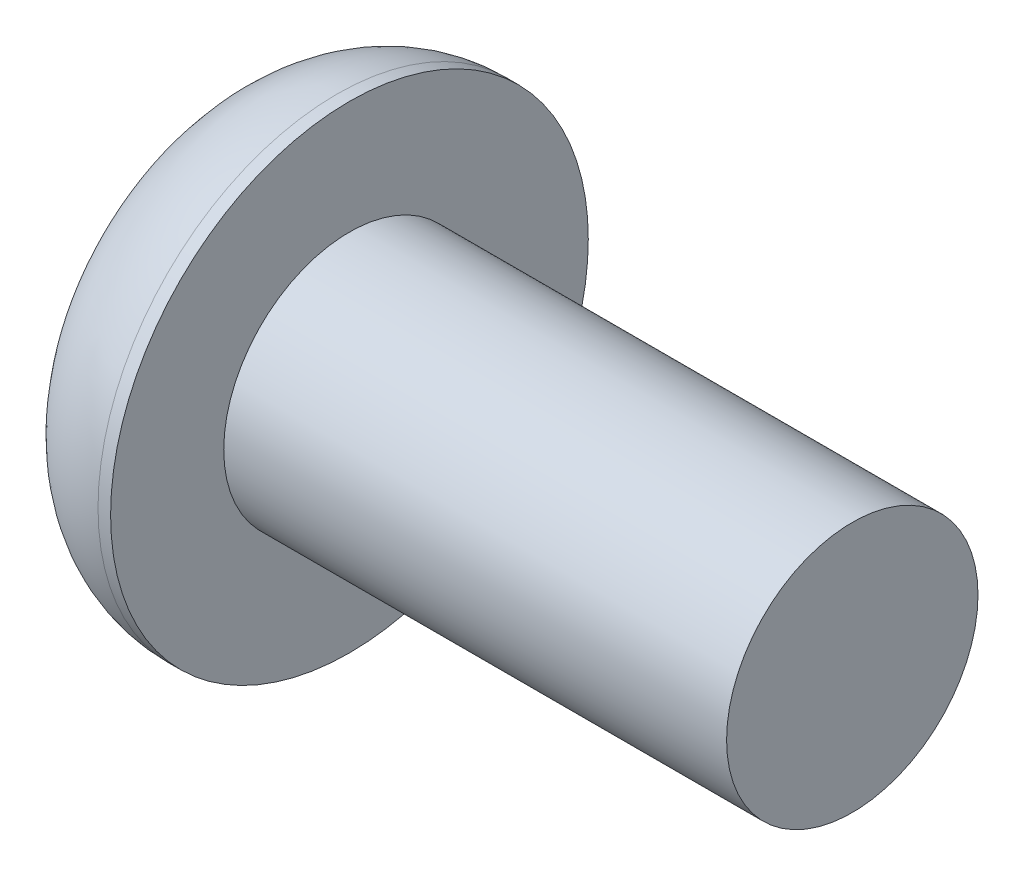
ISO-10303-21;
HEADER;
FILE_DESCRIPTION(('STEP AP214'),'2;1');
FILE_NAME('part.step','',(''),(''),'','','');
FILE_SCHEMA(('AUTOMOTIVE_DESIGN { 1 0 10303 214 1 1 1 1 }'));
ENDSEC;
DATA;
#1=APPLICATION_CONTEXT('core data for automotive mechanical design processes');
#2=APPLICATION_PROTOCOL_DEFINITION('international standard','automotive_design',2000,#1);
#3=PRODUCT_CONTEXT('',#1,'mechanical');
#4=PRODUCT('Part','Part','',(#3));
#5=PRODUCT_RELATED_PRODUCT_CATEGORY('part','',(#4));
#6=PRODUCT_DEFINITION_FORMATION('','',#4);
#7=PRODUCT_DEFINITION_CONTEXT('part definition',#1,'design');
#8=PRODUCT_DEFINITION('design','',#6,#7);
#9=PRODUCT_DEFINITION_SHAPE('','',#8);
#10=(LENGTH_UNIT() NAMED_UNIT(*) SI_UNIT(.MILLI.,.METRE.));
#11=(NAMED_UNIT(*) PLANE_ANGLE_UNIT() SI_UNIT($,.RADIAN.));
#12=(NAMED_UNIT(*) SI_UNIT($,.STERADIAN.) SOLID_ANGLE_UNIT());
#13=UNCERTAINTY_MEASURE_WITH_UNIT(LENGTH_MEASURE(1.E-05),#10,'distance_accuracy_value','');
#14=(GEOMETRIC_REPRESENTATION_CONTEXT(3) GLOBAL_UNCERTAINTY_ASSIGNED_CONTEXT((#13)) GLOBAL_UNIT_ASSIGNED_CONTEXT((#10,
#11,#12)) REPRESENTATION_CONTEXT('',''));
#15=CARTESIAN_POINT('',(0.,0.,0.));
#16=DIRECTION('',(0.,0.,1.));
#17=DIRECTION('',(1.,0.,0.));
#18=AXIS2_PLACEMENT_3D('',#15,#16,#17);
#19=CARTESIAN_POINT('',(0.,0.,-2.25));
#20=DIRECTION('',(-1.,0.,0.));
#21=DIRECTION('',(0.,0.,1.));
#22=AXIS2_PLACEMENT_3D('',#19,#20,#21);
#23=PLANE('',#22);
#24=DIRECTION('',(0.,0.866025403784439,0.5));
#25=VECTOR('',#24,1.);
#26=CARTESIAN_POINT('',(0.,-1.5,0.866025403784439));
#27=LINE('',#26,#25);
#28=CARTESIAN_POINT('',(0.,-1.5,0.866025403784439));
#29=VERTEX_POINT('',#28);
#30=CARTESIAN_POINT('',(0.,0.,1.73205080756888));
#31=VERTEX_POINT('',#30);
#32=EDGE_CURVE('E47',#29,#31,#27,.T.);
#33=ORIENTED_EDGE('',*,*,#32,.F.);
#34=DIRECTION('',(0.,0.,1.));
#35=VECTOR('',#34,1.);
#36=CARTESIAN_POINT('',(0.,-1.5,-0.866025403784439));
#37=LINE('',#36,#35);
#38=CARTESIAN_POINT('',(0.,-1.5,-0.866025403784439));
#39=VERTEX_POINT('',#38);
#40=EDGE_CURVE('E130',#39,#29,#37,.T.);
#41=ORIENTED_EDGE('',*,*,#40,.F.);
#42=DIRECTION('',(0.,-0.866025403784439,0.5));
#43=VECTOR('',#42,1.);
#44=CARTESIAN_POINT('',(0.,0.,-1.73205080756888));
#45=LINE('',#44,#43);
#46=CARTESIAN_POINT('',(0.,0.,-1.73205080756888));
#47=VERTEX_POINT('',#46);
#48=EDGE_CURVE('E128',#47,#39,#45,.T.);
#49=ORIENTED_EDGE('',*,*,#48,.F.);
#50=DIRECTION('',(0.,-0.866025403784439,-0.5));
#51=VECTOR('',#50,1.);
#52=CARTESIAN_POINT('',(0.,1.5,-0.866025403784439));
#53=LINE('',#52,#51);
#54=CARTESIAN_POINT('',(0.,1.5,-0.866025403784439));
#55=VERTEX_POINT('',#54);
#56=EDGE_CURVE('E95',#55,#47,#53,.T.);
#57=ORIENTED_EDGE('',*,*,#56,.F.);
#58=DIRECTION('',(0.,0.,-1.));
#59=VECTOR('',#58,1.);
#60=CARTESIAN_POINT('',(0.,1.5,0.866025403784438));
#61=LINE('',#60,#59);
#62=CARTESIAN_POINT('',(0.,1.5,0.866025403784438));
#63=VERTEX_POINT('',#62);
#64=EDGE_CURVE('E124',#63,#55,#61,.T.);
#65=ORIENTED_EDGE('',*,*,#64,.F.);
#66=DIRECTION('',(0.,0.866025403784438,-0.5));
#67=VECTOR('',#66,1.);
#68=CARTESIAN_POINT('',(0.,0.,1.73205080756888));
#69=LINE('',#68,#67);
#70=EDGE_CURVE('E121',#31,#63,#69,.T.);
#71=ORIENTED_EDGE('',*,*,#70,.F.);
#72=EDGE_LOOP('',(#33,#41,#49,#57,#65,#71));
#73=FACE_BOUND('',#72,.T.);
#74=CARTESIAN_POINT('',(0.,0.,0.));
#75=DIRECTION('',(1.,0.,0.));
#76=DIRECTION('',(0.,0.,-1.));
#77=AXIS2_PLACEMENT_3D('',#74,#75,#76);
#78=CIRCLE('',#77,2.25);
#79=CARTESIAN_POINT('',(0.,0.,-2.25));
#80=VERTEX_POINT('',#79);
#81=EDGE_CURVE('E11',#80,#80,#78,.T.);
#82=ORIENTED_EDGE('',*,*,#81,.F.);
#83=EDGE_LOOP('',(#82));
#84=FACE_BOUND('',#83,.T.);
#85=ADVANCED_FACE('F33',(#73,#84),#23,.T.);
#86=CARTESIAN_POINT('',(2.5,0.,0.));
#87=DIRECTION('',(1.,0.,0.));
#88=DIRECTION('',(0.,0.,-1.));
#89=AXIS2_PLACEMENT_3D('',#86,#87,#88);
#90=DEGENERATE_TOROIDAL_SURFACE('',#89,2.25,2.5,.T.);
#91=ORIENTED_EDGE('',*,*,#81,.T.);
#92=EDGE_LOOP('',(#91));
#93=FACE_BOUND('',#92,.T.);
#94=CARTESIAN_POINT('',(2.5,0.,0.));
#95=DIRECTION('',(1.,0.,0.));
#96=DIRECTION('',(0.,0.,-1.));
#97=AXIS2_PLACEMENT_3D('',#94,#95,#96);
#98=CIRCLE('',#97,4.75);
#99=CARTESIAN_POINT('',(2.5,0.,-4.75));
#100=VERTEX_POINT('',#99);
#101=EDGE_CURVE('E40',#100,#100,#98,.T.);
#102=ORIENTED_EDGE('',*,*,#101,.F.);
#103=EDGE_LOOP('',(#102));
#104=FACE_BOUND('',#103,.T.);
#105=ADVANCED_FACE('F153',(#93,#104),#90,.T.);
#106=CARTESIAN_POINT('',(0.,0.,0.));
#107=DIRECTION('',(1.,0.,0.));
#108=DIRECTION('',(0.,0.,-1.));
#109=AXIS2_PLACEMENT_3D('',#106,#107,#108);
#110=CYLINDRICAL_SURFACE('',#109,4.75);
#111=ORIENTED_EDGE('',*,*,#101,.T.);
#112=EDGE_LOOP('',(#111));
#113=FACE_BOUND('',#112,.T.);
#114=CARTESIAN_POINT('',(2.75,0.,0.));
#115=DIRECTION('',(1.,0.,0.));
#116=DIRECTION('',(0.,0.,-1.));
#117=AXIS2_PLACEMENT_3D('',#114,#115,#116);
#118=CIRCLE('',#117,4.75);
#119=CARTESIAN_POINT('',(2.75,0.,-4.75));
#120=VERTEX_POINT('',#119);
#121=EDGE_CURVE('E145',#120,#120,#118,.T.);
#122=ORIENTED_EDGE('',*,*,#121,.F.);
#123=EDGE_LOOP('',(#122));
#124=FACE_BOUND('',#123,.T.);
#125=ADVANCED_FACE('F150',(#113,#124),#110,.T.);
#126=CARTESIAN_POINT('',(2.75,0.,-2.5));
#127=DIRECTION('',(1.,0.,0.));
#128=DIRECTION('',(0.,0.,-1.));
#129=AXIS2_PLACEMENT_3D('',#126,#127,#128);
#130=PLANE('',#129);
#131=ORIENTED_EDGE('',*,*,#121,.T.);
#132=EDGE_LOOP('',(#131));
#133=FACE_BOUND('',#132,.T.);
#134=CARTESIAN_POINT('',(2.75,0.,0.));
#135=DIRECTION('',(1.,0.,0.));
#136=DIRECTION('',(0.,0.,-1.));
#137=AXIS2_PLACEMENT_3D('',#134,#135,#136);
#138=CIRCLE('',#137,2.5);
#139=CARTESIAN_POINT('',(2.75,0.,-2.5));
#140=VERTEX_POINT('',#139);
#141=EDGE_CURVE('E142',#140,#140,#138,.T.);
#142=ORIENTED_EDGE('',*,*,#141,.F.);
#143=EDGE_LOOP('',(#142));
#144=FACE_BOUND('',#143,.T.);
#145=ADVANCED_FACE('F160',(#133,#144),#130,.T.);
#146=CARTESIAN_POINT('',(0.,0.,0.));
#147=DIRECTION('',(1.,0.,0.));
#148=DIRECTION('',(0.,0.,-1.));
#149=AXIS2_PLACEMENT_3D('',#146,#147,#148);
#150=CYLINDRICAL_SURFACE('',#149,2.5);
#151=ORIENTED_EDGE('',*,*,#141,.T.);
#152=EDGE_LOOP('',(#151));
#153=FACE_BOUND('',#152,.T.);
#154=CARTESIAN_POINT('',(12.75,0.,0.));
#155=DIRECTION('',(1.,0.,0.));
#156=DIRECTION('',(0.,0.,-1.));
#157=AXIS2_PLACEMENT_3D('',#154,#155,#156);
#158=CIRCLE('',#157,2.5);
#159=CARTESIAN_POINT('',(12.75,0.,-2.5));
#160=VERTEX_POINT('',#159);
#161=EDGE_CURVE('E134',#160,#160,#158,.T.);
#162=ORIENTED_EDGE('',*,*,#161,.F.);
#163=EDGE_LOOP('',(#162));
#164=FACE_BOUND('',#163,.T.);
#165=ADVANCED_FACE('F166',(#153,#164),#150,.T.);
#166=CARTESIAN_POINT('',(12.75,0.,0.));
#167=DIRECTION('',(1.,0.,0.));
#168=DIRECTION('',(0.,0.,-1.));
#169=AXIS2_PLACEMENT_3D('',#166,#167,#168);
#170=PLANE('',#169);
#171=ORIENTED_EDGE('',*,*,#161,.T.);
#172=EDGE_LOOP('',(#171));
#173=FACE_BOUND('',#172,.T.);
#174=ADVANCED_FACE('F170',(#173),#170,.T.);
#175=CARTESIAN_POINT('',(1.56,-1.5,0.866025403784439));
#176=DIRECTION('',(0.,-0.5,0.866025403784439));
#177=DIRECTION('',(0.,-0.866025403784439,-0.5));
#178=AXIS2_PLACEMENT_3D('',#175,#176,#177);
#179=PLANE('',#178);
#180=ORIENTED_EDGE('',*,*,#32,.T.);
#181=DIRECTION('',(-1.,0.,0.));
#182=VECTOR('',#181,1.);
#183=CARTESIAN_POINT('',(1.56,0.,1.73205080756888));
#184=LINE('',#183,#182);
#185=CARTESIAN_POINT('',(1.56,0.,1.73205080756888));
#186=VERTEX_POINT('',#185);
#187=EDGE_CURVE('E77',#186,#31,#184,.T.);
#188=ORIENTED_EDGE('',*,*,#187,.F.);
#189=DIRECTION('',(0.,0.866025403784439,0.5));
#190=VECTOR('',#189,1.);
#191=CARTESIAN_POINT('',(1.56,-1.5,0.866025403784439));
#192=LINE('',#191,#190);
#193=CARTESIAN_POINT('',(1.56,-1.5,0.866025403784439));
#194=VERTEX_POINT('',#193);
#195=EDGE_CURVE('E132',#194,#186,#192,.T.);
#196=ORIENTED_EDGE('',*,*,#195,.F.);
#197=DIRECTION('',(-1.,0.,0.));
#198=VECTOR('',#197,1.);
#199=CARTESIAN_POINT('',(1.56,-1.5,0.866025403784439));
#200=LINE('',#199,#198);
#201=EDGE_CURVE('E55',#194,#29,#200,.T.);
#202=ORIENTED_EDGE('',*,*,#201,.T.);
#203=EDGE_LOOP('',(#180,#188,#196,#202));
#204=FACE_BOUND('',#203,.T.);
#205=ADVANCED_FACE('F174',(#204),#179,.F.);
#206=CARTESIAN_POINT('',(1.56,-1.5,-0.866025403784439));
#207=DIRECTION('',(0.,-1.,0.));
#208=DIRECTION('',(0.,0.,-1.));
#209=AXIS2_PLACEMENT_3D('',#206,#207,#208);
#210=PLANE('',#209);
#211=ORIENTED_EDGE('',*,*,#40,.T.);
#212=ORIENTED_EDGE('',*,*,#201,.F.);
#213=DIRECTION('',(0.,0.,1.));
#214=VECTOR('',#213,1.);
#215=CARTESIAN_POINT('',(1.56,-1.5,-0.866025403784439));
#216=LINE('',#215,#214);
#217=CARTESIAN_POINT('',(1.56,-1.5,-0.866025403784439));
#218=VERTEX_POINT('',#217);
#219=EDGE_CURVE('E107',#218,#194,#216,.T.);
#220=ORIENTED_EDGE('',*,*,#219,.F.);
#221=DIRECTION('',(-1.,0.,0.));
#222=VECTOR('',#221,1.);
#223=CARTESIAN_POINT('',(1.56,-1.5,-0.866025403784439));
#224=LINE('',#223,#222);
#225=EDGE_CURVE('E99',#218,#39,#224,.T.);
#226=ORIENTED_EDGE('',*,*,#225,.T.);
#227=EDGE_LOOP('',(#211,#212,#220,#226));
#228=FACE_BOUND('',#227,.T.);
#229=ADVANCED_FACE('F178',(#228),#210,.F.);
#230=CARTESIAN_POINT('',(1.56,0.,-1.73205080756888));
#231=DIRECTION('',(0.,-0.5,-0.866025403784439));
#232=DIRECTION('',(0.,0.866025403784439,-0.5));
#233=AXIS2_PLACEMENT_3D('',#230,#231,#232);
#234=PLANE('',#233);
#235=ORIENTED_EDGE('',*,*,#48,.T.);
#236=ORIENTED_EDGE('',*,*,#225,.F.);
#237=DIRECTION('',(0.,-0.866025403784439,0.5));
#238=VECTOR('',#237,1.);
#239=CARTESIAN_POINT('',(1.56,0.,-1.73205080756888));
#240=LINE('',#239,#238);
#241=CARTESIAN_POINT('',(1.56,0.,-1.73205080756888));
#242=VERTEX_POINT('',#241);
#243=EDGE_CURVE('E103',#242,#218,#240,.T.);
#244=ORIENTED_EDGE('',*,*,#243,.F.);
#245=DIRECTION('',(-1.,0.,0.));
#246=VECTOR('',#245,1.);
#247=CARTESIAN_POINT('',(1.56,0.,-1.73205080756888));
#248=LINE('',#247,#246);
#249=EDGE_CURVE('E88',#242,#47,#248,.T.);
#250=ORIENTED_EDGE('',*,*,#249,.T.);
#251=EDGE_LOOP('',(#235,#236,#244,#250));
#252=FACE_BOUND('',#251,.T.);
#253=ADVANCED_FACE('F104',(#252),#234,.F.);
#254=CARTESIAN_POINT('',(1.56,1.5,-0.866025403784439));
#255=DIRECTION('',(0.,0.5,-0.866025403784439));
#256=DIRECTION('',(0.,0.866025403784439,0.5));
#257=AXIS2_PLACEMENT_3D('',#254,#255,#256);
#258=PLANE('',#257);
#259=ORIENTED_EDGE('',*,*,#56,.T.);
#260=ORIENTED_EDGE('',*,*,#249,.F.);
#261=DIRECTION('',(0.,-0.866025403784439,-0.5));
#262=VECTOR('',#261,1.);
#263=CARTESIAN_POINT('',(1.56,1.5,-0.866025403784439));
#264=LINE('',#263,#262);
#265=CARTESIAN_POINT('',(1.56,1.5,-0.866025403784439));
#266=VERTEX_POINT('',#265);
#267=EDGE_CURVE('E92',#266,#242,#264,.T.);
#268=ORIENTED_EDGE('',*,*,#267,.F.);
#269=DIRECTION('',(-1.,0.,0.));
#270=VECTOR('',#269,1.);
#271=CARTESIAN_POINT('',(1.56,1.5,-0.866025403784439));
#272=LINE('',#271,#270);
#273=EDGE_CURVE('E100',#266,#55,#272,.T.);
#274=ORIENTED_EDGE('',*,*,#273,.T.);
#275=EDGE_LOOP('',(#259,#260,#268,#274));
#276=FACE_BOUND('',#275,.T.);
#277=ADVANCED_FACE('F90',(#276),#258,.F.);
#278=CARTESIAN_POINT('',(1.56,1.5,0.866025403784438));
#279=DIRECTION('',(0.,1.,0.));
#280=DIRECTION('',(0.,0.,1.));
#281=AXIS2_PLACEMENT_3D('',#278,#279,#280);
#282=PLANE('',#281);
#283=ORIENTED_EDGE('',*,*,#64,.T.);
#284=ORIENTED_EDGE('',*,*,#273,.F.);
#285=DIRECTION('',(0.,0.,-1.));
#286=VECTOR('',#285,1.);
#287=CARTESIAN_POINT('',(1.56,1.5,0.866025403784438));
#288=LINE('',#287,#286);
#289=CARTESIAN_POINT('',(1.56,1.5,0.866025403784438));
#290=VERTEX_POINT('',#289);
#291=EDGE_CURVE('E113',#290,#266,#288,.T.);
#292=ORIENTED_EDGE('',*,*,#291,.F.);
#293=DIRECTION('',(-1.,0.,0.));
#294=VECTOR('',#293,1.);
#295=CARTESIAN_POINT('',(1.56,1.5,0.866025403784438));
#296=LINE('',#295,#294);
#297=EDGE_CURVE('E137',#290,#63,#296,.T.);
#298=ORIENTED_EDGE('',*,*,#297,.T.);
#299=EDGE_LOOP('',(#283,#284,#292,#298));
#300=FACE_BOUND('',#299,.T.);
#301=ADVANCED_FACE('F182',(#300),#282,.F.);
#302=CARTESIAN_POINT('',(1.56,0.,1.73205080756888));
#303=DIRECTION('',(0.,0.5,0.866025403784438));
#304=DIRECTION('',(0.,-0.866025403784439,0.5));
#305=AXIS2_PLACEMENT_3D('',#302,#303,#304);
#306=PLANE('',#305);
#307=ORIENTED_EDGE('',*,*,#70,.T.);
#308=ORIENTED_EDGE('',*,*,#297,.F.);
#309=DIRECTION('',(0.,0.866025403784438,-0.5));
#310=VECTOR('',#309,1.);
#311=CARTESIAN_POINT('',(1.56,0.,1.73205080756888));
#312=LINE('',#311,#310);
#313=EDGE_CURVE('E115',#186,#290,#312,.T.);
#314=ORIENTED_EDGE('',*,*,#313,.F.);
#315=ORIENTED_EDGE('',*,*,#187,.T.);
#316=EDGE_LOOP('',(#307,#308,#314,#315));
#317=FACE_BOUND('',#316,.T.);
#318=ADVANCED_FACE('F179',(#317),#306,.F.);
#319=CARTESIAN_POINT('',(1.56,0.,0.));
#320=DIRECTION('',(-1.,0.,0.));
#321=DIRECTION('',(0.,0.,1.));
#322=AXIS2_PLACEMENT_3D('',#319,#320,#321);
#323=PLANE('',#322);
#324=ORIENTED_EDGE('',*,*,#195,.T.);
#325=ORIENTED_EDGE('',*,*,#313,.T.);
#326=ORIENTED_EDGE('',*,*,#291,.T.);
#327=ORIENTED_EDGE('',*,*,#267,.T.);
#328=ORIENTED_EDGE('',*,*,#243,.T.);
#329=ORIENTED_EDGE('',*,*,#219,.T.);
#330=EDGE_LOOP('',(#324,#325,#326,#327,#328,#329));
#331=FACE_BOUND('',#330,.T.);
#332=ADVANCED_FACE('F110',(#331),#323,.T.);
#333=CLOSED_SHELL('',(#85,#105,#125,#145,#165,#174,#205,#229,#253,#277,#301,#318,#332));
#334=MANIFOLD_SOLID_BREP('B2',#333);
#335=ADVANCED_BREP_SHAPE_REPRESENTATION('',(#18,#334),#14);
#336=SHAPE_DEFINITION_REPRESENTATION(#9,#335);
ENDSEC;
END-ISO-10303-21;
